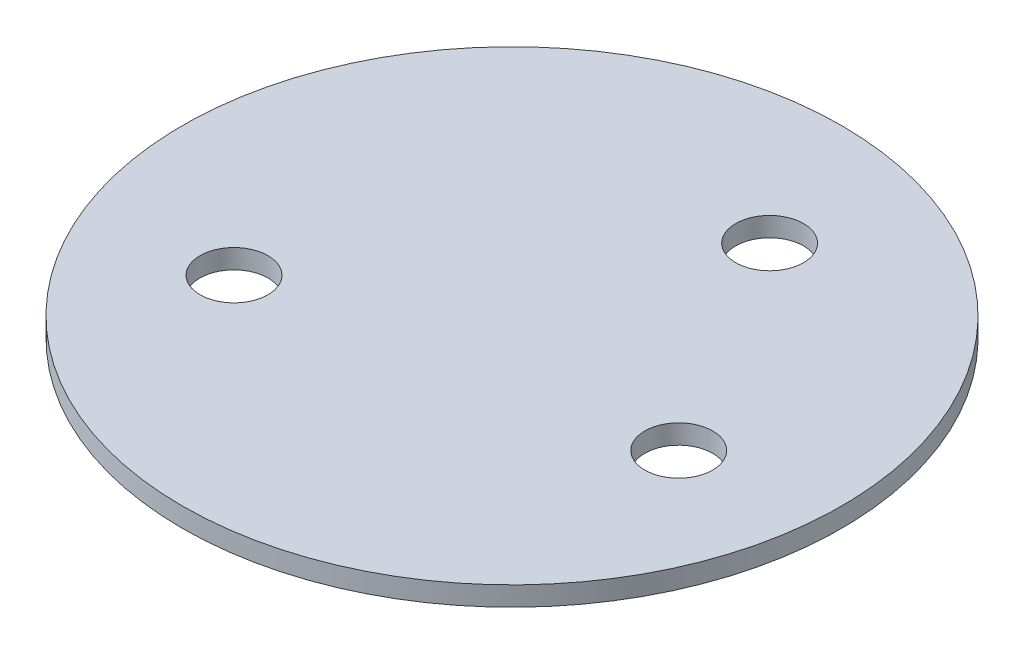
ISO-10303-21;
HEADER;
FILE_DESCRIPTION(('STEP AP214'),'2;1');
FILE_NAME('part.step','',(''),(''),'','','');
FILE_SCHEMA(('AUTOMOTIVE_DESIGN { 1 0 10303 214 1 1 1 1 }'));
ENDSEC;
DATA;
#1=APPLICATION_CONTEXT('core data for automotive mechanical design processes');
#2=APPLICATION_PROTOCOL_DEFINITION('international standard','automotive_design',2000,#1);
#3=PRODUCT_CONTEXT('',#1,'mechanical');
#4=PRODUCT('Part','Part','',(#3));
#5=PRODUCT_RELATED_PRODUCT_CATEGORY('part','',(#4));
#6=PRODUCT_DEFINITION_FORMATION('','',#4);
#7=PRODUCT_DEFINITION_CONTEXT('part definition',#1,'design');
#8=PRODUCT_DEFINITION('design','',#6,#7);
#9=PRODUCT_DEFINITION_SHAPE('','',#8);
#10=(LENGTH_UNIT() NAMED_UNIT(*) SI_UNIT(.MILLI.,.METRE.));
#11=(NAMED_UNIT(*) PLANE_ANGLE_UNIT() SI_UNIT($,.RADIAN.));
#12=(NAMED_UNIT(*) SI_UNIT($,.STERADIAN.) SOLID_ANGLE_UNIT());
#13=UNCERTAINTY_MEASURE_WITH_UNIT(LENGTH_MEASURE(1.E-05),#10,'distance_accuracy_value','');
#14=(GEOMETRIC_REPRESENTATION_CONTEXT(3) GLOBAL_UNCERTAINTY_ASSIGNED_CONTEXT((#13)) GLOBAL_UNIT_ASSIGNED_CONTEXT((#10,
#11,#12)) REPRESENTATION_CONTEXT('',''));
#15=CARTESIAN_POINT('',(0.,0.,0.));
#16=DIRECTION('',(0.,0.,1.));
#17=DIRECTION('',(1.,0.,0.));
#18=AXIS2_PLACEMENT_3D('',#15,#16,#17);
#19=CARTESIAN_POINT('',(969.445355232628,-6.35,-1092.23067299365));
#20=DIRECTION('',(0.,-1.,0.));
#21=DIRECTION('',(0.,0.,-1.));
#22=AXIS2_PLACEMENT_3D('',#19,#20,#21);
#23=PLANE('',#22);
#24=CARTESIAN_POINT('',(991.017480219274,-6.35,-1155.04929973728));
#25=DIRECTION('',(0.,-1.,0.));
#26=DIRECTION('',(0.,0.,-1.));
#27=AXIS2_PLACEMENT_3D('',#24,#25,#26);
#28=CIRCLE('',#27,11.1124999999999);
#29=CARTESIAN_POINT('',(991.017480219274,-6.35,-1166.16179973728));
#30=VERTEX_POINT('',#29);
#31=EDGE_CURVE('E49',#30,#30,#28,.T.);
#32=ORIENTED_EDGE('',*,*,#31,.F.);
#33=EDGE_LOOP('',(#32));
#34=FACE_BOUND('',#33,.T.);
#35=CARTESIAN_POINT('',(969.445355232628,-6.35,-1092.23067299365));
#36=DIRECTION('',(0.,-1.,0.));
#37=DIRECTION('',(0.,0.,-1.));
#38=AXIS2_PLACEMENT_3D('',#35,#36,#37);
#39=CIRCLE('',#38,107.95);
#40=CARTESIAN_POINT('',(969.445355232628,-6.35,-1200.18067299365));
#41=VERTEX_POINT('',#40);
#42=EDGE_CURVE('E10',#41,#41,#39,.T.);
#43=ORIENTED_EDGE('',*,*,#42,.T.);
#44=EDGE_LOOP('',(#43));
#45=FACE_BOUND('',#44,.T.);
#46=CARTESIAN_POINT('',(1034.96338078354,-6.35,-1081.3254095716));
#47=DIRECTION('',(0.,-1.,0.));
#48=DIRECTION('',(0.,0.,-1.));
#49=AXIS2_PLACEMENT_3D('',#46,#47,#48);
#50=CIRCLE('',#49,11.1124999999999);
#51=CARTESIAN_POINT('',(1034.96338078354,-6.35,-1092.4379095716));
#52=VERTEX_POINT('',#51);
#53=EDGE_CURVE('E44',#52,#52,#50,.T.);
#54=ORIENTED_EDGE('',*,*,#53,.F.);
#55=EDGE_LOOP('',(#54));
#56=FACE_BOUND('',#55,.T.);
#57=CARTESIAN_POINT('',(912.392953219633,-6.35,-1058.2224406529));
#58=DIRECTION('',(0.,-1.,0.));
#59=DIRECTION('',(0.,0.,-1.));
#60=AXIS2_PLACEMENT_3D('',#57,#58,#59);
#61=CIRCLE('',#60,11.1124999999999);
#62=CARTESIAN_POINT('',(912.392953219633,-6.35,-1069.3349406529));
#63=VERTEX_POINT('',#62);
#64=EDGE_CURVE('E55',#63,#63,#61,.T.);
#65=ORIENTED_EDGE('',*,*,#64,.F.);
#66=EDGE_LOOP('',(#65));
#67=FACE_BOUND('',#66,.T.);
#68=ADVANCED_FACE('F33',(#34,#45,#56,#67),#23,.T.);
#69=CARTESIAN_POINT('',(969.445355232628,0.,-1092.23067299365));
#70=DIRECTION('',(0.,-1.,0.));
#71=DIRECTION('',(0.,0.,-1.));
#72=AXIS2_PLACEMENT_3D('',#69,#70,#71);
#73=PLANE('',#72);
#74=CARTESIAN_POINT('',(991.017480219274,0.,-1155.04929973728));
#75=DIRECTION('',(0.,-1.,0.));
#76=DIRECTION('',(0.,0.,-1.));
#77=AXIS2_PLACEMENT_3D('',#74,#75,#76);
#78=CIRCLE('',#77,11.1124999999999);
#79=CARTESIAN_POINT('',(991.017480219274,0.,-1166.16179973728));
#80=VERTEX_POINT('',#79);
#81=EDGE_CURVE('E52',#80,#80,#78,.T.);
#82=ORIENTED_EDGE('',*,*,#81,.T.);
#83=EDGE_LOOP('',(#82));
#84=FACE_BOUND('',#83,.T.);
#85=CARTESIAN_POINT('',(969.445355232628,0.,-1092.23067299365));
#86=DIRECTION('',(0.,-1.,0.));
#87=DIRECTION('',(0.,0.,-1.));
#88=AXIS2_PLACEMENT_3D('',#85,#86,#87);
#89=CIRCLE('',#88,107.95);
#90=CARTESIAN_POINT('',(969.445355232628,0.,-1200.18067299365));
#91=VERTEX_POINT('',#90);
#92=EDGE_CURVE('E37',#91,#91,#89,.T.);
#93=ORIENTED_EDGE('',*,*,#92,.F.);
#94=EDGE_LOOP('',(#93));
#95=FACE_BOUND('',#94,.T.);
#96=CARTESIAN_POINT('',(1034.96338078354,0.,-1081.3254095716));
#97=DIRECTION('',(0.,-1.,0.));
#98=DIRECTION('',(0.,0.,-1.));
#99=AXIS2_PLACEMENT_3D('',#96,#97,#98);
#100=CIRCLE('',#99,11.1124999999999);
#101=CARTESIAN_POINT('',(1034.96338078354,0.,-1092.4379095716));
#102=VERTEX_POINT('',#101);
#103=EDGE_CURVE('E46',#102,#102,#100,.T.);
#104=ORIENTED_EDGE('',*,*,#103,.T.);
#105=EDGE_LOOP('',(#104));
#106=FACE_BOUND('',#105,.T.);
#107=CARTESIAN_POINT('',(912.392953219633,0.,-1058.2224406529));
#108=DIRECTION('',(0.,-1.,0.));
#109=DIRECTION('',(0.,0.,-1.));
#110=AXIS2_PLACEMENT_3D('',#107,#108,#109);
#111=CIRCLE('',#110,11.1124999999999);
#112=CARTESIAN_POINT('',(912.392953219633,0.,-1069.3349406529));
#113=VERTEX_POINT('',#112);
#114=EDGE_CURVE('E58',#113,#113,#111,.T.);
#115=ORIENTED_EDGE('',*,*,#114,.T.);
#116=EDGE_LOOP('',(#115));
#117=FACE_BOUND('',#116,.T.);
#118=ADVANCED_FACE('F68',(#84,#95,#106,#117),#73,.F.);
#119=CARTESIAN_POINT('',(969.445355232628,-6.35,-1092.23067299365));
#120=DIRECTION('',(0.,1.,0.));
#121=DIRECTION('',(0.,0.,1.));
#122=AXIS2_PLACEMENT_3D('',#119,#120,#121);
#123=CYLINDRICAL_SURFACE('',#122,107.95);
#124=ORIENTED_EDGE('',*,*,#42,.F.);
#125=EDGE_LOOP('',(#124));
#126=FACE_BOUND('',#125,.T.);
#127=ORIENTED_EDGE('',*,*,#92,.T.);
#128=EDGE_LOOP('',(#127));
#129=FACE_BOUND('',#128,.T.);
#130=ADVANCED_FACE('F35',(#126,#129),#123,.T.);
#131=CARTESIAN_POINT('',(1034.96338078354,-6.35,-1081.3254095716));
#132=DIRECTION('',(0.,1.,0.));
#133=DIRECTION('',(0.,0.,1.));
#134=AXIS2_PLACEMENT_3D('',#131,#132,#133);
#135=CYLINDRICAL_SURFACE('',#134,11.1124999999999);
#136=ORIENTED_EDGE('',*,*,#53,.T.);
#137=EDGE_LOOP('',(#136));
#138=FACE_BOUND('',#137,.T.);
#139=ORIENTED_EDGE('',*,*,#103,.F.);
#140=EDGE_LOOP('',(#139));
#141=FACE_BOUND('',#140,.T.);
#142=ADVANCED_FACE('F77',(#138,#141),#135,.F.);
#143=CARTESIAN_POINT('',(991.017480219274,-6.35,-1155.04929973728));
#144=DIRECTION('',(0.,1.,0.));
#145=DIRECTION('',(0.,0.,1.));
#146=AXIS2_PLACEMENT_3D('',#143,#144,#145);
#147=CYLINDRICAL_SURFACE('',#146,11.1124999999999);
#148=ORIENTED_EDGE('',*,*,#31,.T.);
#149=EDGE_LOOP('',(#148));
#150=FACE_BOUND('',#149,.T.);
#151=ORIENTED_EDGE('',*,*,#81,.F.);
#152=EDGE_LOOP('',(#151));
#153=FACE_BOUND('',#152,.T.);
#154=ADVANCED_FACE('F80',(#150,#153),#147,.F.);
#155=CARTESIAN_POINT('',(912.392953219633,-6.35,-1058.2224406529));
#156=DIRECTION('',(0.,1.,0.));
#157=DIRECTION('',(0.,0.,1.));
#158=AXIS2_PLACEMENT_3D('',#155,#156,#157);
#159=CYLINDRICAL_SURFACE('',#158,11.1124999999999);
#160=ORIENTED_EDGE('',*,*,#64,.T.);
#161=EDGE_LOOP('',(#160));
#162=FACE_BOUND('',#161,.T.);
#163=ORIENTED_EDGE('',*,*,#114,.F.);
#164=EDGE_LOOP('',(#163));
#165=FACE_BOUND('',#164,.T.);
#166=ADVANCED_FACE('F64',(#162,#165),#159,.F.);
#167=CLOSED_SHELL('',(#68,#118,#130,#142,#154,#166));
#168=MANIFOLD_SOLID_BREP('B2',#167);
#169=ADVANCED_BREP_SHAPE_REPRESENTATION('',(#18,#168),#14);
#170=SHAPE_DEFINITION_REPRESENTATION(#9,#169);
ENDSEC;
END-ISO-10303-21;
